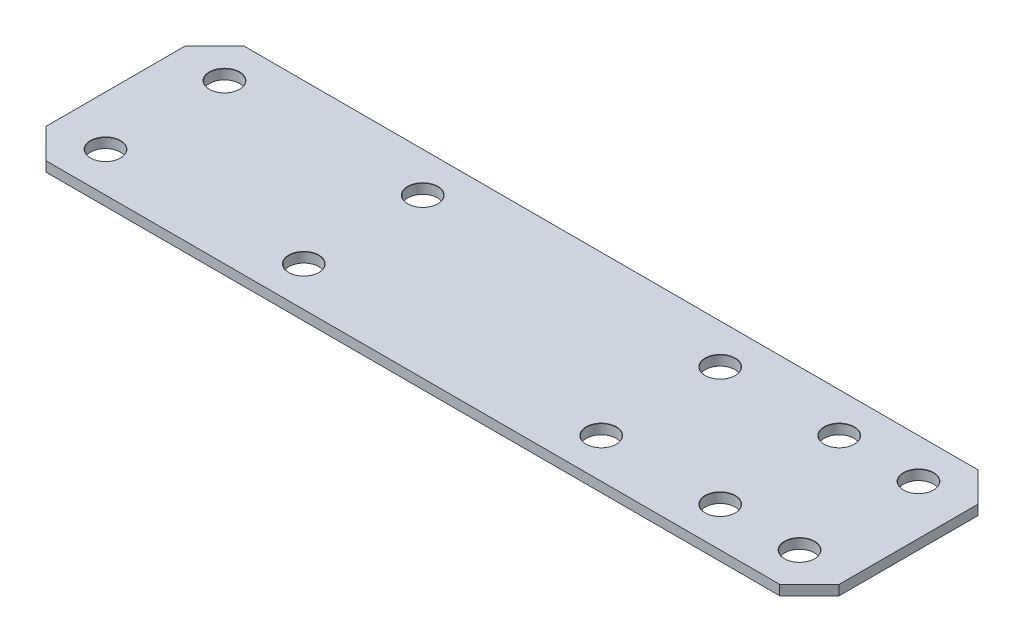
ISO-10303-21;
HEADER;
FILE_DESCRIPTION(('STEP AP214'),'2;1');
FILE_NAME('part.step','',(''),(''),'','','');
FILE_SCHEMA(('AUTOMOTIVE_DESIGN { 1 0 10303 214 1 1 1 1 }'));
ENDSEC;
DATA;
#1=APPLICATION_CONTEXT('core data for automotive mechanical design processes');
#2=APPLICATION_PROTOCOL_DEFINITION('international standard','automotive_design',2000,#1);
#3=PRODUCT_CONTEXT('',#1,'mechanical');
#4=PRODUCT('Part','Part','',(#3));
#5=PRODUCT_RELATED_PRODUCT_CATEGORY('part','',(#4));
#6=PRODUCT_DEFINITION_FORMATION('','',#4);
#7=PRODUCT_DEFINITION_CONTEXT('part definition',#1,'design');
#8=PRODUCT_DEFINITION('design','',#6,#7);
#9=PRODUCT_DEFINITION_SHAPE('','',#8);
#10=(LENGTH_UNIT() NAMED_UNIT(*) SI_UNIT(.MILLI.,.METRE.));
#11=(NAMED_UNIT(*) PLANE_ANGLE_UNIT() SI_UNIT($,.RADIAN.));
#12=(NAMED_UNIT(*) SI_UNIT($,.STERADIAN.) SOLID_ANGLE_UNIT());
#13=UNCERTAINTY_MEASURE_WITH_UNIT(LENGTH_MEASURE(1.E-05),#10,'distance_accuracy_value','');
#14=(GEOMETRIC_REPRESENTATION_CONTEXT(3) GLOBAL_UNCERTAINTY_ASSIGNED_CONTEXT((#13)) GLOBAL_UNIT_ASSIGNED_CONTEXT((#10,
#11,#12)) REPRESENTATION_CONTEXT('',''));
#15=CARTESIAN_POINT('',(0.,0.,0.));
#16=DIRECTION('',(0.,0.,1.));
#17=DIRECTION('',(1.,0.,0.));
#18=AXIS2_PLACEMENT_3D('',#15,#16,#17);
#19=CARTESIAN_POINT('',(0.,1.,0.));
#20=DIRECTION('',(-1.,0.,0.));
#21=DIRECTION('',(0.,0.,1.));
#22=AXIS2_PLACEMENT_3D('',#19,#20,#21);
#23=PLANE('',#22);
#24=DIRECTION('',(0.,0.,-1.));
#25=VECTOR('',#24,1.);
#26=CARTESIAN_POINT('',(0.,0.,0.));
#27=LINE('',#26,#25);
#28=CARTESIAN_POINT('',(0.,0.,-3.00000000000002));
#29=VERTEX_POINT('',#28);
#30=CARTESIAN_POINT('',(0.,0.,-17.));
#31=VERTEX_POINT('',#30);
#32=EDGE_CURVE('E174',#29,#31,#27,.T.);
#33=ORIENTED_EDGE('',*,*,#32,.F.);
#34=DIRECTION('',(0.,1.,0.));
#35=VECTOR('',#34,1.);
#36=CARTESIAN_POINT('',(0.,1.,-3.00000000000002));
#37=LINE('',#36,#35);
#38=CARTESIAN_POINT('',(0.,1.,-3.00000000000002));
#39=VERTEX_POINT('',#38);
#40=EDGE_CURVE('E110',#29,#39,#37,.T.);
#41=ORIENTED_EDGE('',*,*,#40,.T.);
#42=DIRECTION('',(0.,0.,-1.));
#43=VECTOR('',#42,1.);
#44=CARTESIAN_POINT('',(0.,1.,0.));
#45=LINE('',#44,#43);
#46=CARTESIAN_POINT('',(0.,1.,-17.));
#47=VERTEX_POINT('',#46);
#48=EDGE_CURVE('E132',#39,#47,#45,.T.);
#49=ORIENTED_EDGE('',*,*,#48,.T.);
#50=DIRECTION('',(0.,-1.,0.));
#51=VECTOR('',#50,1.);
#52=CARTESIAN_POINT('',(0.,1.,-17.));
#53=LINE('',#52,#51);
#54=EDGE_CURVE('E115',#47,#31,#53,.T.);
#55=ORIENTED_EDGE('',*,*,#54,.T.);
#56=EDGE_LOOP('',(#33,#41,#49,#55));
#57=FACE_BOUND('',#56,.T.);
#58=ADVANCED_FACE('F37',(#57),#23,.T.);
#59=CARTESIAN_POINT('',(0.,1.,0.));
#60=DIRECTION('',(0.,0.,-1.));
#61=DIRECTION('',(-1.,0.,0.));
#62=AXIS2_PLACEMENT_3D('',#59,#60,#61);
#63=PLANE('',#62);
#64=DIRECTION('',(1.,0.,0.));
#65=VECTOR('',#64,1.);
#66=CARTESIAN_POINT('',(0.,1.,0.));
#67=LINE('',#66,#65);
#68=CARTESIAN_POINT('',(3.,1.,0.));
#69=VERTEX_POINT('',#68);
#70=CARTESIAN_POINT('',(77.,1.,0.));
#71=VERTEX_POINT('',#70);
#72=EDGE_CURVE('E125',#69,#71,#67,.T.);
#73=ORIENTED_EDGE('',*,*,#72,.F.);
#74=DIRECTION('',(0.,-1.,0.));
#75=VECTOR('',#74,1.);
#76=CARTESIAN_POINT('',(3.,0.,0.));
#77=LINE('',#76,#75);
#78=CARTESIAN_POINT('',(3.,0.,0.));
#79=VERTEX_POINT('',#78);
#80=EDGE_CURVE('E109',#69,#79,#77,.T.);
#81=ORIENTED_EDGE('',*,*,#80,.T.);
#82=DIRECTION('',(1.,0.,0.));
#83=VECTOR('',#82,1.);
#84=CARTESIAN_POINT('',(0.,0.,0.));
#85=LINE('',#84,#83);
#86=CARTESIAN_POINT('',(77.,0.,0.));
#87=VERTEX_POINT('',#86);
#88=EDGE_CURVE('E122',#79,#87,#85,.T.);
#89=ORIENTED_EDGE('',*,*,#88,.T.);
#90=DIRECTION('',(0.,1.,0.));
#91=VECTOR('',#90,1.);
#92=CARTESIAN_POINT('',(77.,1.,0.));
#93=LINE('',#92,#91);
#94=EDGE_CURVE('E127',#87,#71,#93,.T.);
#95=ORIENTED_EDGE('',*,*,#94,.T.);
#96=EDGE_LOOP('',(#73,#81,#89,#95));
#97=FACE_BOUND('',#96,.T.);
#98=ADVANCED_FACE('F121',(#97),#63,.F.);
#99=CARTESIAN_POINT('',(80.,1.,0.));
#100=DIRECTION('',(-1.,0.,0.));
#101=DIRECTION('',(0.,0.,1.));
#102=AXIS2_PLACEMENT_3D('',#99,#100,#101);
#103=PLANE('',#102);
#104=DIRECTION('',(0.,0.,-1.));
#105=VECTOR('',#104,1.);
#106=CARTESIAN_POINT('',(80.,1.,0.));
#107=LINE('',#106,#105);
#108=CARTESIAN_POINT('',(80.,1.,-3.));
#109=VERTEX_POINT('',#108);
#110=CARTESIAN_POINT('',(80.,1.,-17.));
#111=VERTEX_POINT('',#110);
#112=EDGE_CURVE('E164',#109,#111,#107,.T.);
#113=ORIENTED_EDGE('',*,*,#112,.F.);
#114=DIRECTION('',(0.,-1.,0.));
#115=VECTOR('',#114,1.);
#116=CARTESIAN_POINT('',(80.,1.,-3.));
#117=LINE('',#116,#115);
#118=CARTESIAN_POINT('',(80.,0.,-3.));
#119=VERTEX_POINT('',#118);
#120=EDGE_CURVE('E11',#109,#119,#117,.T.);
#121=ORIENTED_EDGE('',*,*,#120,.T.);
#122=DIRECTION('',(0.,0.,-1.));
#123=VECTOR('',#122,1.);
#124=CARTESIAN_POINT('',(80.,0.,0.));
#125=LINE('',#124,#123);
#126=CARTESIAN_POINT('',(80.,0.,-17.));
#127=VERTEX_POINT('',#126);
#128=EDGE_CURVE('E133',#119,#127,#125,.T.);
#129=ORIENTED_EDGE('',*,*,#128,.T.);
#130=DIRECTION('',(0.,1.,0.));
#131=VECTOR('',#130,1.);
#132=CARTESIAN_POINT('',(80.,1.,-17.));
#133=LINE('',#132,#131);
#134=EDGE_CURVE('E46',#127,#111,#133,.T.);
#135=ORIENTED_EDGE('',*,*,#134,.T.);
#136=EDGE_LOOP('',(#113,#121,#129,#135));
#137=FACE_BOUND('',#136,.T.);
#138=ADVANCED_FACE('F163',(#137),#103,.F.);
#139=CARTESIAN_POINT('',(0.,1.,-20.));
#140=DIRECTION('',(0.,0.,-1.));
#141=DIRECTION('',(-1.,0.,0.));
#142=AXIS2_PLACEMENT_3D('',#139,#140,#141);
#143=PLANE('',#142);
#144=DIRECTION('',(1.,0.,0.));
#145=VECTOR('',#144,1.);
#146=CARTESIAN_POINT('',(0.,0.,-20.));
#147=LINE('',#146,#145);
#148=CARTESIAN_POINT('',(3.00000000000002,0.,-20.));
#149=VERTEX_POINT('',#148);
#150=CARTESIAN_POINT('',(77.,0.,-20.));
#151=VERTEX_POINT('',#150);
#152=EDGE_CURVE('E139',#149,#151,#147,.T.);
#153=ORIENTED_EDGE('',*,*,#152,.F.);
#154=DIRECTION('',(0.,1.,0.));
#155=VECTOR('',#154,1.);
#156=CARTESIAN_POINT('',(3.00000000000002,1.,-20.));
#157=LINE('',#156,#155);
#158=CARTESIAN_POINT('',(3.00000000000002,1.,-20.));
#159=VERTEX_POINT('',#158);
#160=EDGE_CURVE('E60',#149,#159,#157,.T.);
#161=ORIENTED_EDGE('',*,*,#160,.T.);
#162=DIRECTION('',(1.,0.,0.));
#163=VECTOR('',#162,1.);
#164=CARTESIAN_POINT('',(0.,1.,-20.));
#165=LINE('',#164,#163);
#166=CARTESIAN_POINT('',(77.,1.,-20.));
#167=VERTEX_POINT('',#166);
#168=EDGE_CURVE('E136',#159,#167,#165,.T.);
#169=ORIENTED_EDGE('',*,*,#168,.T.);
#170=DIRECTION('',(0.,-1.,0.));
#171=VECTOR('',#170,1.);
#172=CARTESIAN_POINT('',(77.,0.,-20.));
#173=LINE('',#172,#171);
#174=EDGE_CURVE('E157',#167,#151,#173,.T.);
#175=ORIENTED_EDGE('',*,*,#174,.T.);
#176=EDGE_LOOP('',(#153,#161,#169,#175));
#177=FACE_BOUND('',#176,.T.);
#178=ADVANCED_FACE('F173',(#177),#143,.T.);
#179=CARTESIAN_POINT('',(0.,1.,0.));
#180=DIRECTION('',(0.,-1.,0.));
#181=DIRECTION('',(0.,0.,-1.));
#182=AXIS2_PLACEMENT_3D('',#179,#180,#181);
#183=PLANE('',#182);
#184=CARTESIAN_POINT('',(5.,1.,-16.));
#185=DIRECTION('',(0.,1.,0.));
#186=DIRECTION('',(0.,0.,1.));
#187=AXIS2_PLACEMENT_3D('',#184,#185,#186);
#188=CIRCLE('',#187,1.525);
#189=CARTESIAN_POINT('',(5.,1.,-14.475));
#190=VERTEX_POINT('',#189);
#191=EDGE_CURVE('E266',#190,#190,#188,.T.);
#192=ORIENTED_EDGE('',*,*,#191,.F.);
#193=EDGE_LOOP('',(#192));
#194=FACE_BOUND('',#193,.T.);
#195=CARTESIAN_POINT('',(5.,1.,-4.));
#196=DIRECTION('',(0.,1.,0.));
#197=DIRECTION('',(0.,0.,1.));
#198=AXIS2_PLACEMENT_3D('',#195,#196,#197);
#199=CIRCLE('',#198,1.525);
#200=CARTESIAN_POINT('',(5.,1.,-2.475));
#201=VERTEX_POINT('',#200);
#202=EDGE_CURVE('E257',#201,#201,#199,.T.);
#203=ORIENTED_EDGE('',*,*,#202,.F.);
#204=EDGE_LOOP('',(#203));
#205=FACE_BOUND('',#204,.T.);
#206=CARTESIAN_POINT('',(25.,1.,-16.));
#207=DIRECTION('',(0.,1.,0.));
#208=DIRECTION('',(0.,0.,1.));
#209=AXIS2_PLACEMENT_3D('',#206,#207,#208);
#210=CIRCLE('',#209,1.525);
#211=CARTESIAN_POINT('',(25.,1.,-14.475));
#212=VERTEX_POINT('',#211);
#213=EDGE_CURVE('E248',#212,#212,#210,.T.);
#214=ORIENTED_EDGE('',*,*,#213,.F.);
#215=EDGE_LOOP('',(#214));
#216=FACE_BOUND('',#215,.T.);
#217=CARTESIAN_POINT('',(55.,1.,-16.));
#218=DIRECTION('',(0.,1.,0.));
#219=DIRECTION('',(0.,0.,1.));
#220=AXIS2_PLACEMENT_3D('',#217,#218,#219);
#221=CIRCLE('',#220,1.525);
#222=CARTESIAN_POINT('',(55.,1.,-14.475));
#223=VERTEX_POINT('',#222);
#224=EDGE_CURVE('E239',#223,#223,#221,.T.);
#225=ORIENTED_EDGE('',*,*,#224,.F.);
#226=EDGE_LOOP('',(#225));
#227=FACE_BOUND('',#226,.T.);
#228=CARTESIAN_POINT('',(25.,1.,-4.));
#229=DIRECTION('',(0.,1.,0.));
#230=DIRECTION('',(0.,0.,1.));
#231=AXIS2_PLACEMENT_3D('',#228,#229,#230);
#232=CIRCLE('',#231,1.525);
#233=CARTESIAN_POINT('',(25.,1.,-2.475));
#234=VERTEX_POINT('',#233);
#235=EDGE_CURVE('E230',#234,#234,#232,.T.);
#236=ORIENTED_EDGE('',*,*,#235,.F.);
#237=EDGE_LOOP('',(#236));
#238=FACE_BOUND('',#237,.T.);
#239=CARTESIAN_POINT('',(55.,1.,-4.));
#240=DIRECTION('',(0.,1.,0.));
#241=DIRECTION('',(0.,0.,1.));
#242=AXIS2_PLACEMENT_3D('',#239,#240,#241);
#243=CIRCLE('',#242,1.525);
#244=CARTESIAN_POINT('',(55.,1.,-2.475));
#245=VERTEX_POINT('',#244);
#246=EDGE_CURVE('E221',#245,#245,#243,.T.);
#247=ORIENTED_EDGE('',*,*,#246,.F.);
#248=EDGE_LOOP('',(#247));
#249=FACE_BOUND('',#248,.T.);
#250=CARTESIAN_POINT('',(75.,1.,-4.));
#251=DIRECTION('',(0.,1.,0.));
#252=DIRECTION('',(0.,0.,1.));
#253=AXIS2_PLACEMENT_3D('',#250,#251,#252);
#254=CIRCLE('',#253,1.525);
#255=CARTESIAN_POINT('',(75.,1.,-2.475));
#256=VERTEX_POINT('',#255);
#257=EDGE_CURVE('E212',#256,#256,#254,.T.);
#258=ORIENTED_EDGE('',*,*,#257,.F.);
#259=EDGE_LOOP('',(#258));
#260=FACE_BOUND('',#259,.T.);
#261=CARTESIAN_POINT('',(75.,1.,-16.));
#262=DIRECTION('',(0.,1.,0.));
#263=DIRECTION('',(0.,0.,1.));
#264=AXIS2_PLACEMENT_3D('',#261,#262,#263);
#265=CIRCLE('',#264,1.525);
#266=CARTESIAN_POINT('',(75.,1.,-14.475));
#267=VERTEX_POINT('',#266);
#268=EDGE_CURVE('E203',#267,#267,#265,.T.);
#269=ORIENTED_EDGE('',*,*,#268,.F.);
#270=EDGE_LOOP('',(#269));
#271=FACE_BOUND('',#270,.T.);
#272=CARTESIAN_POINT('',(67.,1.,-16.));
#273=DIRECTION('',(0.,1.,0.));
#274=DIRECTION('',(0.,0.,1.));
#275=AXIS2_PLACEMENT_3D('',#272,#273,#274);
#276=CIRCLE('',#275,1.525);
#277=CARTESIAN_POINT('',(67.,1.,-14.475));
#278=VERTEX_POINT('',#277);
#279=EDGE_CURVE('E194',#278,#278,#276,.T.);
#280=ORIENTED_EDGE('',*,*,#279,.F.);
#281=EDGE_LOOP('',(#280));
#282=FACE_BOUND('',#281,.T.);
#283=CARTESIAN_POINT('',(67.,1.,-4.));
#284=DIRECTION('',(0.,1.,0.));
#285=DIRECTION('',(0.,0.,1.));
#286=AXIS2_PLACEMENT_3D('',#283,#284,#285);
#287=CIRCLE('',#286,1.525);
#288=CARTESIAN_POINT('',(67.,1.,-2.475));
#289=VERTEX_POINT('',#288);
#290=EDGE_CURVE('E185',#289,#289,#287,.T.);
#291=ORIENTED_EDGE('',*,*,#290,.F.);
#292=EDGE_LOOP('',(#291));
#293=FACE_BOUND('',#292,.T.);
#294=ORIENTED_EDGE('',*,*,#48,.F.);
#295=DIRECTION('',(0.707106781186546,0.,0.707106781186549));
#296=VECTOR('',#295,1.);
#297=CARTESIAN_POINT('',(3.,1.,0.));
#298=LINE('',#297,#296);
#299=EDGE_CURVE('E155',#39,#69,#298,.T.);
#300=ORIENTED_EDGE('',*,*,#299,.T.);
#301=ORIENTED_EDGE('',*,*,#72,.T.);
#302=DIRECTION('',(-0.707106781186549,0.,0.707106781186546));
#303=VECTOR('',#302,1.);
#304=CARTESIAN_POINT('',(80.,1.,-3.));
#305=LINE('',#304,#303);
#306=EDGE_CURVE('E151',#71,#109,#305,.F.);
#307=ORIENTED_EDGE('',*,*,#306,.T.);
#308=ORIENTED_EDGE('',*,*,#112,.T.);
#309=DIRECTION('',(-0.707106781186546,0.,-0.707106781186549));
#310=VECTOR('',#309,1.);
#311=CARTESIAN_POINT('',(77.,1.,-20.));
#312=LINE('',#311,#310);
#313=EDGE_CURVE('E53',#111,#167,#312,.T.);
#314=ORIENTED_EDGE('',*,*,#313,.T.);
#315=ORIENTED_EDGE('',*,*,#168,.F.);
#316=DIRECTION('',(0.707106781186549,0.,-0.707106781186546));
#317=VECTOR('',#316,1.);
#318=CARTESIAN_POINT('',(0.,1.,-17.));
#319=LINE('',#318,#317);
#320=EDGE_CURVE('E153',#159,#47,#319,.F.);
#321=ORIENTED_EDGE('',*,*,#320,.T.);
#322=EDGE_LOOP('',(#294,#300,#301,#307,#308,#314,#315,#321));
#323=FACE_BOUND('',#322,.T.);
#324=ADVANCED_FACE('F168',(#194,#205,#216,#227,#238,#249,#260,#271,#282,#293,#323),#183,.F.);
#325=CARTESIAN_POINT('',(0.,0.,0.));
#326=DIRECTION('',(0.,-1.,0.));
#327=DIRECTION('',(0.,0.,-1.));
#328=AXIS2_PLACEMENT_3D('',#325,#326,#327);
#329=PLANE('',#328);
#330=CARTESIAN_POINT('',(5.,0.,-16.));
#331=DIRECTION('',(0.,1.,0.));
#332=DIRECTION('',(0.,0.,1.));
#333=AXIS2_PLACEMENT_3D('',#330,#331,#332);
#334=CIRCLE('',#333,1.5);
#335=CARTESIAN_POINT('',(5.,0.,-14.5));
#336=VERTEX_POINT('',#335);
#337=EDGE_CURVE('E260',#336,#336,#334,.T.);
#338=ORIENTED_EDGE('',*,*,#337,.T.);
#339=EDGE_LOOP('',(#338));
#340=FACE_BOUND('',#339,.T.);
#341=CARTESIAN_POINT('',(5.,0.,-4.));
#342=DIRECTION('',(0.,1.,0.));
#343=DIRECTION('',(0.,0.,1.));
#344=AXIS2_PLACEMENT_3D('',#341,#342,#343);
#345=CIRCLE('',#344,1.5);
#346=CARTESIAN_POINT('',(5.,0.,-2.5));
#347=VERTEX_POINT('',#346);
#348=EDGE_CURVE('E251',#347,#347,#345,.T.);
#349=ORIENTED_EDGE('',*,*,#348,.T.);
#350=EDGE_LOOP('',(#349));
#351=FACE_BOUND('',#350,.T.);
#352=CARTESIAN_POINT('',(25.,0.,-16.));
#353=DIRECTION('',(0.,1.,0.));
#354=DIRECTION('',(0.,0.,1.));
#355=AXIS2_PLACEMENT_3D('',#352,#353,#354);
#356=CIRCLE('',#355,1.5);
#357=CARTESIAN_POINT('',(25.,0.,-14.5));
#358=VERTEX_POINT('',#357);
#359=EDGE_CURVE('E242',#358,#358,#356,.T.);
#360=ORIENTED_EDGE('',*,*,#359,.T.);
#361=EDGE_LOOP('',(#360));
#362=FACE_BOUND('',#361,.T.);
#363=CARTESIAN_POINT('',(55.,0.,-16.));
#364=DIRECTION('',(0.,1.,0.));
#365=DIRECTION('',(0.,0.,1.));
#366=AXIS2_PLACEMENT_3D('',#363,#364,#365);
#367=CIRCLE('',#366,1.5);
#368=CARTESIAN_POINT('',(55.,0.,-14.5));
#369=VERTEX_POINT('',#368);
#370=EDGE_CURVE('E233',#369,#369,#367,.T.);
#371=ORIENTED_EDGE('',*,*,#370,.T.);
#372=EDGE_LOOP('',(#371));
#373=FACE_BOUND('',#372,.T.);
#374=CARTESIAN_POINT('',(25.,0.,-4.));
#375=DIRECTION('',(0.,1.,0.));
#376=DIRECTION('',(0.,0.,1.));
#377=AXIS2_PLACEMENT_3D('',#374,#375,#376);
#378=CIRCLE('',#377,1.5);
#379=CARTESIAN_POINT('',(25.,0.,-2.5));
#380=VERTEX_POINT('',#379);
#381=EDGE_CURVE('E224',#380,#380,#378,.T.);
#382=ORIENTED_EDGE('',*,*,#381,.T.);
#383=EDGE_LOOP('',(#382));
#384=FACE_BOUND('',#383,.T.);
#385=CARTESIAN_POINT('',(55.,0.,-4.));
#386=DIRECTION('',(0.,1.,0.));
#387=DIRECTION('',(0.,0.,1.));
#388=AXIS2_PLACEMENT_3D('',#385,#386,#387);
#389=CIRCLE('',#388,1.5);
#390=CARTESIAN_POINT('',(55.,0.,-2.5));
#391=VERTEX_POINT('',#390);
#392=EDGE_CURVE('E215',#391,#391,#389,.T.);
#393=ORIENTED_EDGE('',*,*,#392,.T.);
#394=EDGE_LOOP('',(#393));
#395=FACE_BOUND('',#394,.T.);
#396=CARTESIAN_POINT('',(75.,0.,-4.));
#397=DIRECTION('',(0.,1.,0.));
#398=DIRECTION('',(0.,0.,1.));
#399=AXIS2_PLACEMENT_3D('',#396,#397,#398);
#400=CIRCLE('',#399,1.5);
#401=CARTESIAN_POINT('',(75.,0.,-2.5));
#402=VERTEX_POINT('',#401);
#403=EDGE_CURVE('E206',#402,#402,#400,.T.);
#404=ORIENTED_EDGE('',*,*,#403,.T.);
#405=EDGE_LOOP('',(#404));
#406=FACE_BOUND('',#405,.T.);
#407=CARTESIAN_POINT('',(75.,0.,-16.));
#408=DIRECTION('',(0.,1.,0.));
#409=DIRECTION('',(0.,0.,1.));
#410=AXIS2_PLACEMENT_3D('',#407,#408,#409);
#411=CIRCLE('',#410,1.5);
#412=CARTESIAN_POINT('',(75.,0.,-14.5));
#413=VERTEX_POINT('',#412);
#414=EDGE_CURVE('E197',#413,#413,#411,.T.);
#415=ORIENTED_EDGE('',*,*,#414,.T.);
#416=EDGE_LOOP('',(#415));
#417=FACE_BOUND('',#416,.T.);
#418=CARTESIAN_POINT('',(67.,0.,-16.));
#419=DIRECTION('',(0.,1.,0.));
#420=DIRECTION('',(0.,0.,1.));
#421=AXIS2_PLACEMENT_3D('',#418,#419,#420);
#422=CIRCLE('',#421,1.5);
#423=CARTESIAN_POINT('',(67.,0.,-14.5));
#424=VERTEX_POINT('',#423);
#425=EDGE_CURVE('E188',#424,#424,#422,.T.);
#426=ORIENTED_EDGE('',*,*,#425,.T.);
#427=EDGE_LOOP('',(#426));
#428=FACE_BOUND('',#427,.T.);
#429=CARTESIAN_POINT('',(67.,0.,-4.));
#430=DIRECTION('',(0.,1.,0.));
#431=DIRECTION('',(0.,0.,1.));
#432=AXIS2_PLACEMENT_3D('',#429,#430,#431);
#433=CIRCLE('',#432,1.5);
#434=CARTESIAN_POINT('',(67.,0.,-2.5));
#435=VERTEX_POINT('',#434);
#436=EDGE_CURVE('E175',#435,#435,#433,.T.);
#437=ORIENTED_EDGE('',*,*,#436,.T.);
#438=EDGE_LOOP('',(#437));
#439=FACE_BOUND('',#438,.T.);
#440=ORIENTED_EDGE('',*,*,#88,.F.);
#441=DIRECTION('',(-0.707106781186546,0.,-0.707106781186549));
#442=VECTOR('',#441,1.);
#443=CARTESIAN_POINT('',(1.50000000000001,0.,-1.5));
#444=LINE('',#443,#442);
#445=EDGE_CURVE('E105',#79,#29,#444,.T.);
#446=ORIENTED_EDGE('',*,*,#445,.T.);
#447=ORIENTED_EDGE('',*,*,#32,.T.);
#448=DIRECTION('',(-0.707106781186549,0.,0.707106781186546));
#449=VECTOR('',#448,1.);
#450=CARTESIAN_POINT('',(-8.5,0.,-8.50000000000004));
#451=LINE('',#450,#449);
#452=EDGE_CURVE('E116',#31,#149,#451,.F.);
#453=ORIENTED_EDGE('',*,*,#452,.T.);
#454=ORIENTED_EDGE('',*,*,#152,.T.);
#455=DIRECTION('',(0.707106781186546,0.,0.707106781186549));
#456=VECTOR('',#455,1.);
#457=CARTESIAN_POINT('',(48.5000000000002,0.,-48.4999999999999));
#458=LINE('',#457,#456);
#459=EDGE_CURVE('E126',#151,#127,#458,.T.);
#460=ORIENTED_EDGE('',*,*,#459,.T.);
#461=ORIENTED_EDGE('',*,*,#128,.F.);
#462=DIRECTION('',(0.707106781186549,0.,-0.707106781186546));
#463=VECTOR('',#462,1.);
#464=CARTESIAN_POINT('',(38.4999999999998,0.,38.5));
#465=LINE('',#464,#463);
#466=EDGE_CURVE('E131',#119,#87,#465,.F.);
#467=ORIENTED_EDGE('',*,*,#466,.T.);
#468=EDGE_LOOP('',(#440,#446,#447,#453,#454,#460,#461,#467));
#469=FACE_BOUND('',#468,.T.);
#470=ADVANCED_FACE('F129',(#340,#351,#362,#373,#384,#395,#406,#417,#428,#439,#469),#329,.T.);
#471=CARTESIAN_POINT('',(67.,1.,-4.));
#472=DIRECTION('',(0.,1.,0.));
#473=DIRECTION('',(0.,0.,1.));
#474=AXIS2_PLACEMENT_3D('',#471,#472,#473);
#475=CYLINDRICAL_SURFACE('',#474,1.49999999999999);
#476=ORIENTED_EDGE('',*,*,#436,.F.);
#477=EDGE_LOOP('',(#476));
#478=FACE_BOUND('',#477,.T.);
#479=CARTESIAN_POINT('',(67.,0.975000000000003,-4.));
#480=DIRECTION('',(0.,1.,0.));
#481=DIRECTION('',(0.,0.,1.));
#482=AXIS2_PLACEMENT_3D('',#479,#480,#481);
#483=CIRCLE('',#482,1.49999999999999);
#484=CARTESIAN_POINT('',(67.,0.975000000000003,-2.50000000000001));
#485=VERTEX_POINT('',#484);
#486=EDGE_CURVE('E182',#485,#485,#483,.T.);
#487=ORIENTED_EDGE('',*,*,#486,.T.);
#488=EDGE_LOOP('',(#487));
#489=FACE_BOUND('',#488,.T.);
#490=ADVANCED_FACE('F296',(#478,#489),#475,.F.);
#491=CARTESIAN_POINT('',(67.,1.,-4.));
#492=DIRECTION('',(0.,1.,0.));
#493=DIRECTION('',(0.,0.,1.));
#494=AXIS2_PLACEMENT_3D('',#491,#492,#493);
#495=CONICAL_SURFACE('',#494,1.525,0.785398163397691);
#496=ORIENTED_EDGE('',*,*,#486,.F.);
#497=EDGE_LOOP('',(#496));
#498=FACE_BOUND('',#497,.T.);
#499=ORIENTED_EDGE('',*,*,#290,.T.);
#500=EDGE_LOOP('',(#499));
#501=FACE_BOUND('',#500,.T.);
#502=ADVANCED_FACE('F293',(#498,#501),#495,.F.);
#503=CARTESIAN_POINT('',(67.,1.,-16.));
#504=DIRECTION('',(0.,1.,0.));
#505=DIRECTION('',(0.,0.,1.));
#506=AXIS2_PLACEMENT_3D('',#503,#504,#505);
#507=CYLINDRICAL_SURFACE('',#506,1.49999999999999);
#508=ORIENTED_EDGE('',*,*,#425,.F.);
#509=EDGE_LOOP('',(#508));
#510=FACE_BOUND('',#509,.T.);
#511=CARTESIAN_POINT('',(67.,0.975000000000003,-16.));
#512=DIRECTION('',(0.,1.,0.));
#513=DIRECTION('',(0.,0.,1.));
#514=AXIS2_PLACEMENT_3D('',#511,#512,#513);
#515=CIRCLE('',#514,1.49999999999999);
#516=CARTESIAN_POINT('',(67.,0.975000000000003,-14.5));
#517=VERTEX_POINT('',#516);
#518=EDGE_CURVE('E191',#517,#517,#515,.T.);
#519=ORIENTED_EDGE('',*,*,#518,.T.);
#520=EDGE_LOOP('',(#519));
#521=FACE_BOUND('',#520,.T.);
#522=ADVANCED_FACE('F295',(#510,#521),#507,.F.);
#523=CARTESIAN_POINT('',(67.,1.,-16.));
#524=DIRECTION('',(0.,1.,0.));
#525=DIRECTION('',(0.,0.,1.));
#526=AXIS2_PLACEMENT_3D('',#523,#524,#525);
#527=CONICAL_SURFACE('',#526,1.525,0.785398163397691);
#528=ORIENTED_EDGE('',*,*,#518,.F.);
#529=EDGE_LOOP('',(#528));
#530=FACE_BOUND('',#529,.T.);
#531=ORIENTED_EDGE('',*,*,#279,.T.);
#532=EDGE_LOOP('',(#531));
#533=FACE_BOUND('',#532,.T.);
#534=ADVANCED_FACE('F303',(#530,#533),#527,.F.);
#535=CARTESIAN_POINT('',(75.,1.,-16.));
#536=DIRECTION('',(0.,1.,0.));
#537=DIRECTION('',(0.,0.,1.));
#538=AXIS2_PLACEMENT_3D('',#535,#536,#537);
#539=CYLINDRICAL_SURFACE('',#538,1.49999999999999);
#540=ORIENTED_EDGE('',*,*,#414,.F.);
#541=EDGE_LOOP('',(#540));
#542=FACE_BOUND('',#541,.T.);
#543=CARTESIAN_POINT('',(75.,0.975000000000003,-16.));
#544=DIRECTION('',(0.,1.,0.));
#545=DIRECTION('',(0.,0.,1.));
#546=AXIS2_PLACEMENT_3D('',#543,#544,#545);
#547=CIRCLE('',#546,1.49999999999999);
#548=CARTESIAN_POINT('',(75.,0.975000000000003,-14.5));
#549=VERTEX_POINT('',#548);
#550=EDGE_CURVE('E200',#549,#549,#547,.T.);
#551=ORIENTED_EDGE('',*,*,#550,.T.);
#552=EDGE_LOOP('',(#551));
#553=FACE_BOUND('',#552,.T.);
#554=ADVANCED_FACE('F548',(#542,#553),#539,.F.);
#555=CARTESIAN_POINT('',(75.,1.,-16.));
#556=DIRECTION('',(0.,1.,0.));
#557=DIRECTION('',(0.,0.,1.));
#558=AXIS2_PLACEMENT_3D('',#555,#556,#557);
#559=CONICAL_SURFACE('',#558,1.525,0.785398163397691);
#560=ORIENTED_EDGE('',*,*,#550,.F.);
#561=EDGE_LOOP('',(#560));
#562=FACE_BOUND('',#561,.T.);
#563=ORIENTED_EDGE('',*,*,#268,.T.);
#564=EDGE_LOOP('',(#563));
#565=FACE_BOUND('',#564,.T.);
#566=ADVANCED_FACE('F538',(#562,#565),#559,.F.);
#567=CARTESIAN_POINT('',(75.,1.,-4.));
#568=DIRECTION('',(0.,1.,0.));
#569=DIRECTION('',(0.,0.,1.));
#570=AXIS2_PLACEMENT_3D('',#567,#568,#569);
#571=CYLINDRICAL_SURFACE('',#570,1.49999999999999);
#572=ORIENTED_EDGE('',*,*,#403,.F.);
#573=EDGE_LOOP('',(#572));
#574=FACE_BOUND('',#573,.T.);
#575=CARTESIAN_POINT('',(75.,0.975000000000003,-4.));
#576=DIRECTION('',(0.,1.,0.));
#577=DIRECTION('',(0.,0.,1.));
#578=AXIS2_PLACEMENT_3D('',#575,#576,#577);
#579=CIRCLE('',#578,1.49999999999999);
#580=CARTESIAN_POINT('',(75.,0.975000000000003,-2.50000000000001));
#581=VERTEX_POINT('',#580);
#582=EDGE_CURVE('E209',#581,#581,#579,.T.);
#583=ORIENTED_EDGE('',*,*,#582,.T.);
#584=EDGE_LOOP('',(#583));
#585=FACE_BOUND('',#584,.T.);
#586=ADVANCED_FACE('F528',(#574,#585),#571,.F.);
#587=CARTESIAN_POINT('',(75.,1.,-4.));
#588=DIRECTION('',(0.,1.,0.));
#589=DIRECTION('',(0.,0.,1.));
#590=AXIS2_PLACEMENT_3D('',#587,#588,#589);
#591=CONICAL_SURFACE('',#590,1.525,0.785398163397691);
#592=ORIENTED_EDGE('',*,*,#582,.F.);
#593=EDGE_LOOP('',(#592));
#594=FACE_BOUND('',#593,.T.);
#595=ORIENTED_EDGE('',*,*,#257,.T.);
#596=EDGE_LOOP('',(#595));
#597=FACE_BOUND('',#596,.T.);
#598=ADVANCED_FACE('F518',(#594,#597),#591,.F.);
#599=CARTESIAN_POINT('',(55.,1.,-4.));
#600=DIRECTION('',(0.,1.,0.));
#601=DIRECTION('',(0.,0.,1.));
#602=AXIS2_PLACEMENT_3D('',#599,#600,#601);
#603=CYLINDRICAL_SURFACE('',#602,1.49999999999999);
#604=ORIENTED_EDGE('',*,*,#392,.F.);
#605=EDGE_LOOP('',(#604));
#606=FACE_BOUND('',#605,.T.);
#607=CARTESIAN_POINT('',(55.,0.975000000000003,-4.));
#608=DIRECTION('',(0.,1.,0.));
#609=DIRECTION('',(0.,0.,1.));
#610=AXIS2_PLACEMENT_3D('',#607,#608,#609);
#611=CIRCLE('',#610,1.49999999999999);
#612=CARTESIAN_POINT('',(55.,0.975000000000003,-2.50000000000001));
#613=VERTEX_POINT('',#612);
#614=EDGE_CURVE('E218',#613,#613,#611,.T.);
#615=ORIENTED_EDGE('',*,*,#614,.T.);
#616=EDGE_LOOP('',(#615));
#617=FACE_BOUND('',#616,.T.);
#618=ADVANCED_FACE('F508',(#606,#617),#603,.F.);
#619=CARTESIAN_POINT('',(55.,1.,-4.));
#620=DIRECTION('',(0.,1.,0.));
#621=DIRECTION('',(0.,0.,1.));
#622=AXIS2_PLACEMENT_3D('',#619,#620,#621);
#623=CONICAL_SURFACE('',#622,1.525,0.785398163397691);
#624=ORIENTED_EDGE('',*,*,#614,.F.);
#625=EDGE_LOOP('',(#624));
#626=FACE_BOUND('',#625,.T.);
#627=ORIENTED_EDGE('',*,*,#246,.T.);
#628=EDGE_LOOP('',(#627));
#629=FACE_BOUND('',#628,.T.);
#630=ADVANCED_FACE('F498',(#626,#629),#623,.F.);
#631=CARTESIAN_POINT('',(25.,1.,-4.));
#632=DIRECTION('',(0.,1.,0.));
#633=DIRECTION('',(0.,0.,1.));
#634=AXIS2_PLACEMENT_3D('',#631,#632,#633);
#635=CYLINDRICAL_SURFACE('',#634,1.49999999999999);
#636=ORIENTED_EDGE('',*,*,#381,.F.);
#637=EDGE_LOOP('',(#636));
#638=FACE_BOUND('',#637,.T.);
#639=CARTESIAN_POINT('',(25.,0.975000000000003,-4.));
#640=DIRECTION('',(0.,1.,0.));
#641=DIRECTION('',(0.,0.,1.));
#642=AXIS2_PLACEMENT_3D('',#639,#640,#641);
#643=CIRCLE('',#642,1.49999999999999);
#644=CARTESIAN_POINT('',(25.,0.975000000000003,-2.50000000000001));
#645=VERTEX_POINT('',#644);
#646=EDGE_CURVE('E227',#645,#645,#643,.T.);
#647=ORIENTED_EDGE('',*,*,#646,.T.);
#648=EDGE_LOOP('',(#647));
#649=FACE_BOUND('',#648,.T.);
#650=ADVANCED_FACE('F488',(#638,#649),#635,.F.);
#651=CARTESIAN_POINT('',(25.,1.,-4.));
#652=DIRECTION('',(0.,1.,0.));
#653=DIRECTION('',(0.,0.,1.));
#654=AXIS2_PLACEMENT_3D('',#651,#652,#653);
#655=CONICAL_SURFACE('',#654,1.525,0.78539816339776);
#656=ORIENTED_EDGE('',*,*,#646,.F.);
#657=EDGE_LOOP('',(#656));
#658=FACE_BOUND('',#657,.T.);
#659=ORIENTED_EDGE('',*,*,#235,.T.);
#660=EDGE_LOOP('',(#659));
#661=FACE_BOUND('',#660,.T.);
#662=ADVANCED_FACE('F478',(#658,#661),#655,.F.);
#663=CARTESIAN_POINT('',(55.,1.,-16.));
#664=DIRECTION('',(0.,1.,0.));
#665=DIRECTION('',(0.,0.,1.));
#666=AXIS2_PLACEMENT_3D('',#663,#664,#665);
#667=CYLINDRICAL_SURFACE('',#666,1.49999999999999);
#668=ORIENTED_EDGE('',*,*,#370,.F.);
#669=EDGE_LOOP('',(#668));
#670=FACE_BOUND('',#669,.T.);
#671=CARTESIAN_POINT('',(55.,0.975000000000003,-16.));
#672=DIRECTION('',(0.,1.,0.));
#673=DIRECTION('',(0.,0.,1.));
#674=AXIS2_PLACEMENT_3D('',#671,#672,#673);
#675=CIRCLE('',#674,1.49999999999999);
#676=CARTESIAN_POINT('',(55.,0.975000000000003,-14.5));
#677=VERTEX_POINT('',#676);
#678=EDGE_CURVE('E236',#677,#677,#675,.T.);
#679=ORIENTED_EDGE('',*,*,#678,.T.);
#680=EDGE_LOOP('',(#679));
#681=FACE_BOUND('',#680,.T.);
#682=ADVANCED_FACE('F468',(#670,#681),#667,.F.);
#683=CARTESIAN_POINT('',(55.,1.,-16.));
#684=DIRECTION('',(0.,1.,0.));
#685=DIRECTION('',(0.,0.,1.));
#686=AXIS2_PLACEMENT_3D('',#683,#684,#685);
#687=CONICAL_SURFACE('',#686,1.525,0.785398163397691);
#688=ORIENTED_EDGE('',*,*,#678,.F.);
#689=EDGE_LOOP('',(#688));
#690=FACE_BOUND('',#689,.T.);
#691=ORIENTED_EDGE('',*,*,#224,.T.);
#692=EDGE_LOOP('',(#691));
#693=FACE_BOUND('',#692,.T.);
#694=ADVANCED_FACE('F458',(#690,#693),#687,.F.);
#695=CARTESIAN_POINT('',(25.,1.,-16.));
#696=DIRECTION('',(0.,1.,0.));
#697=DIRECTION('',(0.,0.,1.));
#698=AXIS2_PLACEMENT_3D('',#695,#696,#697);
#699=CYLINDRICAL_SURFACE('',#698,1.49999999999999);
#700=ORIENTED_EDGE('',*,*,#359,.F.);
#701=EDGE_LOOP('',(#700));
#702=FACE_BOUND('',#701,.T.);
#703=CARTESIAN_POINT('',(25.,0.975000000000003,-16.));
#704=DIRECTION('',(0.,1.,0.));
#705=DIRECTION('',(0.,0.,1.));
#706=AXIS2_PLACEMENT_3D('',#703,#704,#705);
#707=CIRCLE('',#706,1.49999999999999);
#708=CARTESIAN_POINT('',(25.,0.975000000000003,-14.5));
#709=VERTEX_POINT('',#708);
#710=EDGE_CURVE('E245',#709,#709,#707,.T.);
#711=ORIENTED_EDGE('',*,*,#710,.T.);
#712=EDGE_LOOP('',(#711));
#713=FACE_BOUND('',#712,.T.);
#714=ADVANCED_FACE('F448',(#702,#713),#699,.F.);
#715=CARTESIAN_POINT('',(25.,1.,-16.));
#716=DIRECTION('',(0.,1.,0.));
#717=DIRECTION('',(0.,0.,1.));
#718=AXIS2_PLACEMENT_3D('',#715,#716,#717);
#719=CONICAL_SURFACE('',#718,1.525,0.78539816339776);
#720=ORIENTED_EDGE('',*,*,#710,.F.);
#721=EDGE_LOOP('',(#720));
#722=FACE_BOUND('',#721,.T.);
#723=ORIENTED_EDGE('',*,*,#213,.T.);
#724=EDGE_LOOP('',(#723));
#725=FACE_BOUND('',#724,.T.);
#726=ADVANCED_FACE('F438',(#722,#725),#719,.F.);
#727=CARTESIAN_POINT('',(5.,1.,-4.));
#728=DIRECTION('',(0.,1.,0.));
#729=DIRECTION('',(0.,0.,1.));
#730=AXIS2_PLACEMENT_3D('',#727,#728,#729);
#731=CYLINDRICAL_SURFACE('',#730,1.49999999999999);
#732=ORIENTED_EDGE('',*,*,#348,.F.);
#733=EDGE_LOOP('',(#732));
#734=FACE_BOUND('',#733,.T.);
#735=CARTESIAN_POINT('',(5.,0.975000000000003,-4.));
#736=DIRECTION('',(0.,1.,0.));
#737=DIRECTION('',(0.,0.,1.));
#738=AXIS2_PLACEMENT_3D('',#735,#736,#737);
#739=CIRCLE('',#738,1.49999999999999);
#740=CARTESIAN_POINT('',(5.,0.975000000000003,-2.50000000000001));
#741=VERTEX_POINT('',#740);
#742=EDGE_CURVE('E254',#741,#741,#739,.T.);
#743=ORIENTED_EDGE('',*,*,#742,.T.);
#744=EDGE_LOOP('',(#743));
#745=FACE_BOUND('',#744,.T.);
#746=ADVANCED_FACE('F428',(#734,#745),#731,.F.);
#747=CARTESIAN_POINT('',(5.,1.,-4.));
#748=DIRECTION('',(0.,1.,0.));
#749=DIRECTION('',(0.,0.,1.));
#750=AXIS2_PLACEMENT_3D('',#747,#748,#749);
#751=CONICAL_SURFACE('',#750,1.525,0.785398163397726);
#752=ORIENTED_EDGE('',*,*,#742,.F.);
#753=EDGE_LOOP('',(#752));
#754=FACE_BOUND('',#753,.T.);
#755=ORIENTED_EDGE('',*,*,#202,.T.);
#756=EDGE_LOOP('',(#755));
#757=FACE_BOUND('',#756,.T.);
#758=ADVANCED_FACE('F418',(#754,#757),#751,.F.);
#759=CARTESIAN_POINT('',(5.,1.,-16.));
#760=DIRECTION('',(0.,1.,0.));
#761=DIRECTION('',(0.,0.,1.));
#762=AXIS2_PLACEMENT_3D('',#759,#760,#761);
#763=CYLINDRICAL_SURFACE('',#762,1.49999999999999);
#764=ORIENTED_EDGE('',*,*,#337,.F.);
#765=EDGE_LOOP('',(#764));
#766=FACE_BOUND('',#765,.T.);
#767=CARTESIAN_POINT('',(5.,0.975000000000003,-16.));
#768=DIRECTION('',(0.,1.,0.));
#769=DIRECTION('',(0.,0.,1.));
#770=AXIS2_PLACEMENT_3D('',#767,#768,#769);
#771=CIRCLE('',#770,1.49999999999999);
#772=CARTESIAN_POINT('',(5.,0.975000000000003,-14.5));
#773=VERTEX_POINT('',#772);
#774=EDGE_CURVE('E263',#773,#773,#771,.T.);
#775=ORIENTED_EDGE('',*,*,#774,.T.);
#776=EDGE_LOOP('',(#775));
#777=FACE_BOUND('',#776,.T.);
#778=ADVANCED_FACE('F408',(#766,#777),#763,.F.);
#779=CARTESIAN_POINT('',(5.,1.,-16.));
#780=DIRECTION('',(0.,1.,0.));
#781=DIRECTION('',(0.,0.,1.));
#782=AXIS2_PLACEMENT_3D('',#779,#780,#781);
#783=CONICAL_SURFACE('',#782,1.525,0.785398163397726);
#784=ORIENTED_EDGE('',*,*,#774,.F.);
#785=EDGE_LOOP('',(#784));
#786=FACE_BOUND('',#785,.T.);
#787=ORIENTED_EDGE('',*,*,#191,.T.);
#788=EDGE_LOOP('',(#787));
#789=FACE_BOUND('',#788,.T.);
#790=ADVANCED_FACE('F270',(#786,#789),#783,.F.);
#791=CARTESIAN_POINT('',(3.,1.,0.));
#792=DIRECTION('',(-0.707106781186549,0.,0.707106781186546));
#793=DIRECTION('',(0.,1.,0.));
#794=AXIS2_PLACEMENT_3D('',#791,#792,#793);
#795=PLANE('',#794);
#796=ORIENTED_EDGE('',*,*,#299,.F.);
#797=ORIENTED_EDGE('',*,*,#40,.F.);
#798=ORIENTED_EDGE('',*,*,#445,.F.);
#799=ORIENTED_EDGE('',*,*,#80,.F.);
#800=EDGE_LOOP('',(#796,#797,#798,#799));
#801=FACE_BOUND('',#800,.T.);
#802=ADVANCED_FACE('F108',(#801),#795,.T.);
#803=CARTESIAN_POINT('',(0.,1.,-17.));
#804=DIRECTION('',(0.707106781186546,0.,0.707106781186549));
#805=DIRECTION('',(0.,-1.,0.));
#806=AXIS2_PLACEMENT_3D('',#803,#804,#805);
#807=PLANE('',#806);
#808=ORIENTED_EDGE('',*,*,#320,.F.);
#809=ORIENTED_EDGE('',*,*,#160,.F.);
#810=ORIENTED_EDGE('',*,*,#452,.F.);
#811=ORIENTED_EDGE('',*,*,#54,.F.);
#812=EDGE_LOOP('',(#808,#809,#810,#811));
#813=FACE_BOUND('',#812,.T.);
#814=ADVANCED_FACE('F325',(#813),#807,.F.);
#815=CARTESIAN_POINT('',(80.,1.,-3.));
#816=DIRECTION('',(-0.707106781186546,0.,-0.707106781186549));
#817=DIRECTION('',(0.,-1.,0.));
#818=AXIS2_PLACEMENT_3D('',#815,#816,#817);
#819=PLANE('',#818);
#820=ORIENTED_EDGE('',*,*,#306,.F.);
#821=ORIENTED_EDGE('',*,*,#94,.F.);
#822=ORIENTED_EDGE('',*,*,#466,.F.);
#823=ORIENTED_EDGE('',*,*,#120,.F.);
#824=EDGE_LOOP('',(#820,#821,#822,#823));
#825=FACE_BOUND('',#824,.T.);
#826=ADVANCED_FACE('F330',(#825),#819,.F.);
#827=CARTESIAN_POINT('',(77.,1.,-20.));
#828=DIRECTION('',(0.707106781186549,0.,-0.707106781186546));
#829=DIRECTION('',(0.,1.,0.));
#830=AXIS2_PLACEMENT_3D('',#827,#828,#829);
#831=PLANE('',#830);
#832=ORIENTED_EDGE('',*,*,#313,.F.);
#833=ORIENTED_EDGE('',*,*,#134,.F.);
#834=ORIENTED_EDGE('',*,*,#459,.F.);
#835=ORIENTED_EDGE('',*,*,#174,.F.);
#836=EDGE_LOOP('',(#832,#833,#834,#835));
#837=FACE_BOUND('',#836,.T.);
#838=ADVANCED_FACE('F40',(#837),#831,.T.);
#839=CLOSED_SHELL('',(#58,#98,#138,#178,#324,#470,#490,#502,#522,#534,#554,#566,#586,#598,#618,
#630,#650,#662,#682,#694,#714,#726,#746,#758,#778,#790,#802,#814,#826,#838));
#840=MANIFOLD_SOLID_BREP('B2',#839);
#841=ADVANCED_BREP_SHAPE_REPRESENTATION('',(#18,#840),#14);
#842=SHAPE_DEFINITION_REPRESENTATION(#9,#841);
ENDSEC;
END-ISO-10303-21;
